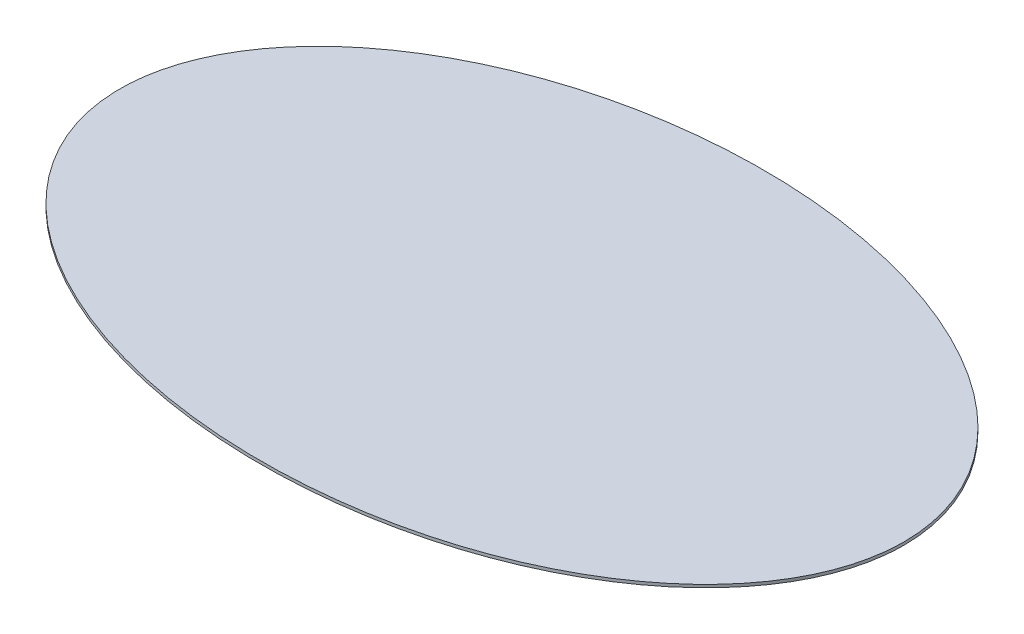
ISO-10303-21;
HEADER;
FILE_DESCRIPTION(('STEP AP214'),'2;1');
FILE_NAME('part.step','',(''),(''),'','','');
FILE_SCHEMA(('AUTOMOTIVE_DESIGN { 1 0 10303 214 1 1 1 1 }'));
ENDSEC;
DATA;
#1=APPLICATION_CONTEXT('core data for automotive mechanical design processes');
#2=APPLICATION_PROTOCOL_DEFINITION('international standard','automotive_design',2000,#1);
#3=PRODUCT_CONTEXT('',#1,'mechanical');
#4=PRODUCT('Part','Part','',(#3));
#5=PRODUCT_RELATED_PRODUCT_CATEGORY('part','',(#4));
#6=PRODUCT_DEFINITION_FORMATION('','',#4);
#7=PRODUCT_DEFINITION_CONTEXT('part definition',#1,'design');
#8=PRODUCT_DEFINITION('design','',#6,#7);
#9=PRODUCT_DEFINITION_SHAPE('','',#8);
#10=(LENGTH_UNIT() NAMED_UNIT(*) SI_UNIT(.MILLI.,.METRE.));
#11=(NAMED_UNIT(*) PLANE_ANGLE_UNIT() SI_UNIT($,.RADIAN.));
#12=(NAMED_UNIT(*) SI_UNIT($,.STERADIAN.) SOLID_ANGLE_UNIT());
#13=UNCERTAINTY_MEASURE_WITH_UNIT(LENGTH_MEASURE(1.E-05),#10,'distance_accuracy_value','');
#14=(GEOMETRIC_REPRESENTATION_CONTEXT(3) GLOBAL_UNCERTAINTY_ASSIGNED_CONTEXT((#13)) GLOBAL_UNIT_ASSIGNED_CONTEXT((#10,
#11,#12)) REPRESENTATION_CONTEXT('',''));
#15=CARTESIAN_POINT('',(0.,0.,0.));
#16=DIRECTION('',(0.,0.,1.));
#17=DIRECTION('',(1.,0.,0.));
#18=AXIS2_PLACEMENT_3D('',#15,#16,#17);
#19=CARTESIAN_POINT('',(0.,0.05,0.));
#20=DIRECTION('',(0.,1.,0.));
#21=DIRECTION('',(1.,0.,0.));
#22=AXIS2_PLACEMENT_3D('',#19,#20,#21);
#23=ELLIPSE('',#22,6.7,4.3);
#24=DIRECTION('',(0.,-1.,0.));
#25=VECTOR('',#24,1.);
#26=SURFACE_OF_LINEAR_EXTRUSION('',#23,#25);
#27=CARTESIAN_POINT('',(6.7,0.05,0.));
#28=VERTEX_POINT('',#27);
#29=EDGE_CURVE('E10',#28,#28,#23,.T.);
#30=ORIENTED_EDGE('',*,*,#29,.F.);
#31=EDGE_LOOP('',(#30));
#32=FACE_BOUND('',#31,.T.);
#33=CARTESIAN_POINT('',(0.,0.,0.));
#34=DIRECTION('',(0.,1.,0.));
#35=DIRECTION('',(1.,0.,0.));
#36=AXIS2_PLACEMENT_3D('',#33,#34,#35);
#37=ELLIPSE('',#36,6.7,4.3);
#38=CARTESIAN_POINT('',(6.7,0.,0.));
#39=VERTEX_POINT('',#38);
#40=EDGE_CURVE('E39',#39,#39,#37,.T.);
#41=ORIENTED_EDGE('',*,*,#40,.T.);
#42=EDGE_LOOP('',(#41));
#43=FACE_BOUND('',#42,.T.);
#44=ADVANCED_FACE('F35',(#32,#43),#26,.F.);
#45=CARTESIAN_POINT('',(0.,0.05,0.));
#46=DIRECTION('',(0.,1.,0.));
#47=DIRECTION('',(0.,0.,1.));
#48=AXIS2_PLACEMENT_3D('',#45,#46,#47);
#49=PLANE('',#48);
#50=ORIENTED_EDGE('',*,*,#29,.T.);
#51=EDGE_LOOP('',(#50));
#52=FACE_BOUND('',#51,.T.);
#53=ADVANCED_FACE('F51',(#52),#49,.T.);
#54=CARTESIAN_POINT('',(0.,0.,0.));
#55=DIRECTION('',(0.,1.,0.));
#56=DIRECTION('',(0.,0.,1.));
#57=AXIS2_PLACEMENT_3D('',#54,#55,#56);
#58=PLANE('',#57);
#59=ORIENTED_EDGE('',*,*,#40,.F.);
#60=EDGE_LOOP('',(#59));
#61=FACE_BOUND('',#60,.T.);
#62=ADVANCED_FACE('F49',(#61),#58,.F.);
#63=CLOSED_SHELL('',(#44,#53,#62));
#64=MANIFOLD_SOLID_BREP('B2',#63);
#65=ADVANCED_BREP_SHAPE_REPRESENTATION('',(#18,#64),#14);
#66=SHAPE_DEFINITION_REPRESENTATION(#9,#65);
ENDSEC;
END-ISO-10303-21;
